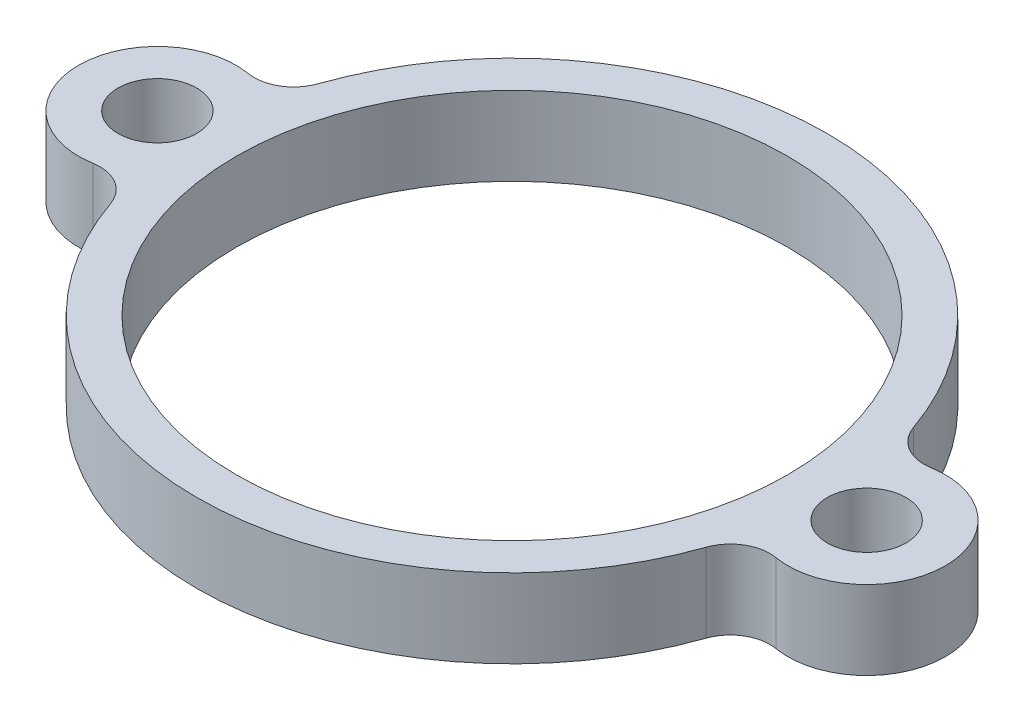
ISO-10303-21;
HEADER;
FILE_DESCRIPTION(('STEP AP214'),'2;1');
FILE_NAME('part.step','',(''),(''),'','','');
FILE_SCHEMA(('AUTOMOTIVE_DESIGN { 1 0 10303 214 1 1 1 1 }'));
ENDSEC;
DATA;
#1=APPLICATION_CONTEXT('core data for automotive mechanical design processes');
#2=APPLICATION_PROTOCOL_DEFINITION('international standard','automotive_design',2000,#1);
#3=PRODUCT_CONTEXT('',#1,'mechanical');
#4=PRODUCT('Part','Part','',(#3));
#5=PRODUCT_RELATED_PRODUCT_CATEGORY('part','',(#4));
#6=PRODUCT_DEFINITION_FORMATION('','',#4);
#7=PRODUCT_DEFINITION_CONTEXT('part definition',#1,'design');
#8=PRODUCT_DEFINITION('design','',#6,#7);
#9=PRODUCT_DEFINITION_SHAPE('','',#8);
#10=(LENGTH_UNIT() NAMED_UNIT(*) SI_UNIT(.MILLI.,.METRE.));
#11=(NAMED_UNIT(*) PLANE_ANGLE_UNIT() SI_UNIT($,.RADIAN.));
#12=(NAMED_UNIT(*) SI_UNIT($,.STERADIAN.) SOLID_ANGLE_UNIT());
#13=UNCERTAINTY_MEASURE_WITH_UNIT(LENGTH_MEASURE(1.E-05),#10,'distance_accuracy_value','');
#14=(GEOMETRIC_REPRESENTATION_CONTEXT(3) GLOBAL_UNCERTAINTY_ASSIGNED_CONTEXT((#13)) GLOBAL_UNIT_ASSIGNED_CONTEXT((#10,
#11,#12)) REPRESENTATION_CONTEXT('',''));
#15=CARTESIAN_POINT('',(0.,0.,0.));
#16=DIRECTION('',(0.,0.,1.));
#17=DIRECTION('',(1.,0.,0.));
#18=AXIS2_PLACEMENT_3D('',#15,#16,#17);
#19=CARTESIAN_POINT('',(21.25,10.,7.39509972887452));
#20=DIRECTION('',(0.,1.,0.));
#21=DIRECTION('',(0.,0.,1.));
#22=AXIS2_PLACEMENT_3D('',#19,#20,#21);
#23=PLANE('',#22);
#24=CARTESIAN_POINT('',(45.,10.,0.));
#25=DIRECTION('',(0.,1.,0.));
#26=DIRECTION('',(0.,0.,1.));
#27=AXIS2_PLACEMENT_3D('',#24,#25,#26);
#28=CIRCLE('',#27,5.);
#29=CARTESIAN_POINT('',(45.,10.,5.));
#30=VERTEX_POINT('',#29);
#31=EDGE_CURVE('E219',#30,#30,#28,.T.);
#32=ORIENTED_EDGE('',*,*,#31,.F.);
#33=EDGE_LOOP('',(#32));
#34=FACE_BOUND('',#33,.T.);
#35=CARTESIAN_POINT('',(42.5,10.,14.790199457749));
#36=DIRECTION('',(0.,-1.,0.));
#37=DIRECTION('',(0.,0.,1.));
#38=AXIS2_PLACEMENT_3D('',#35,#36,#37);
#39=CIRCLE('',#38,5.);
#40=CARTESIAN_POINT('',(37.7777777777778,10.,13.1468439624436));
#41=VERTEX_POINT('',#40);
#42=CARTESIAN_POINT('',(43.3333333333333,10.,9.86013297183269));
#43=VERTEX_POINT('',#42);
#44=EDGE_CURVE('E170',#41,#43,#39,.T.);
#45=ORIENTED_EDGE('',*,*,#44,.T.);
#46=CARTESIAN_POINT('',(45.,10.,0.));
#47=DIRECTION('',(0.,1.,0.));
#48=DIRECTION('',(0.,0.,1.));
#49=AXIS2_PLACEMENT_3D('',#46,#47,#48);
#50=CIRCLE('',#49,10.);
#51=CARTESIAN_POINT('',(43.3333333333333,10.,-9.86013297183269));
#52=VERTEX_POINT('',#51);
#53=EDGE_CURVE('E106',#43,#52,#50,.T.);
#54=ORIENTED_EDGE('',*,*,#53,.T.);
#55=CARTESIAN_POINT('',(42.5,10.,-14.790199457749));
#56=DIRECTION('',(0.,-1.,0.));
#57=DIRECTION('',(0.,0.,-1.));
#58=AXIS2_PLACEMENT_3D('',#55,#56,#57);
#59=CIRCLE('',#58,5.);
#60=CARTESIAN_POINT('',(37.7777777777778,10.,-13.1468439624436));
#61=VERTEX_POINT('',#60);
#62=EDGE_CURVE('E191',#52,#61,#59,.T.);
#63=ORIENTED_EDGE('',*,*,#62,.T.);
#64=CARTESIAN_POINT('',(0.,10.,0.));
#65=DIRECTION('',(0.,1.,0.));
#66=DIRECTION('',(0.,0.,1.));
#67=AXIS2_PLACEMENT_3D('',#64,#65,#66);
#68=CIRCLE('',#67,40.);
#69=CARTESIAN_POINT('',(-37.7777777777778,10.,-13.1468439624436));
#70=VERTEX_POINT('',#69);
#71=EDGE_CURVE('E205',#61,#70,#68,.T.);
#72=ORIENTED_EDGE('',*,*,#71,.T.);
#73=CARTESIAN_POINT('',(-42.5,10.,-14.790199457749));
#74=DIRECTION('',(0.,-1.,0.));
#75=DIRECTION('',(0.,0.,1.));
#76=AXIS2_PLACEMENT_3D('',#73,#74,#75);
#77=CIRCLE('',#76,5.);
#78=CARTESIAN_POINT('',(-43.3333333333333,10.,-9.86013297183269));
#79=VERTEX_POINT('',#78);
#80=EDGE_CURVE('E125',#70,#79,#77,.T.);
#81=ORIENTED_EDGE('',*,*,#80,.T.);
#82=CARTESIAN_POINT('',(-45.,10.,0.));
#83=DIRECTION('',(0.,1.,0.));
#84=DIRECTION('',(0.,0.,1.));
#85=AXIS2_PLACEMENT_3D('',#82,#83,#84);
#86=CIRCLE('',#85,10.);
#87=CARTESIAN_POINT('',(-43.3333333333333,10.,9.8601329718327));
#88=VERTEX_POINT('',#87);
#89=EDGE_CURVE('E119',#79,#88,#86,.T.);
#90=ORIENTED_EDGE('',*,*,#89,.T.);
#91=CARTESIAN_POINT('',(-42.5,10.,14.790199457749));
#92=DIRECTION('',(0.,-1.,0.));
#93=DIRECTION('',(0.,0.,-1.));
#94=AXIS2_PLACEMENT_3D('',#91,#92,#93);
#95=CIRCLE('',#94,5.);
#96=CARTESIAN_POINT('',(-37.7777777777778,10.,13.1468439624436));
#97=VERTEX_POINT('',#96);
#98=EDGE_CURVE('E123',#88,#97,#95,.T.);
#99=ORIENTED_EDGE('',*,*,#98,.T.);
#100=CARTESIAN_POINT('',(0.,10.,0.));
#101=DIRECTION('',(0.,1.,0.));
#102=DIRECTION('',(0.,0.,1.));
#103=AXIS2_PLACEMENT_3D('',#100,#101,#102);
#104=CIRCLE('',#103,40.);
#105=EDGE_CURVE('E63',#97,#41,#104,.T.);
#106=ORIENTED_EDGE('',*,*,#105,.T.);
#107=EDGE_LOOP('',(#45,#54,#63,#72,#81,#90,#99,#106));
#108=FACE_BOUND('',#107,.T.);
#109=CARTESIAN_POINT('',(0.,10.,0.));
#110=DIRECTION('',(0.,1.,0.));
#111=DIRECTION('',(0.,0.,1.));
#112=AXIS2_PLACEMENT_3D('',#109,#110,#111);
#113=CIRCLE('',#112,35.);
#114=CARTESIAN_POINT('',(0.,10.,35.));
#115=VERTEX_POINT('',#114);
#116=EDGE_CURVE('E152',#115,#115,#113,.T.);
#117=ORIENTED_EDGE('',*,*,#116,.F.);
#118=EDGE_LOOP('',(#117));
#119=FACE_BOUND('',#118,.T.);
#120=CARTESIAN_POINT('',(-45.,10.,0.));
#121=DIRECTION('',(0.,1.,0.));
#122=DIRECTION('',(0.,0.,1.));
#123=AXIS2_PLACEMENT_3D('',#120,#121,#122);
#124=CIRCLE('',#123,5.);
#125=CARTESIAN_POINT('',(-45.,10.,5.));
#126=VERTEX_POINT('',#125);
#127=EDGE_CURVE('E227',#126,#126,#124,.T.);
#128=ORIENTED_EDGE('',*,*,#127,.F.);
#129=EDGE_LOOP('',(#128));
#130=FACE_BOUND('',#129,.T.);
#131=ADVANCED_FACE('F45',(#34,#108,#119,#130),#23,.T.);
#132=CARTESIAN_POINT('',(21.25,0.,7.39509972887452));
#133=DIRECTION('',(0.,1.,0.));
#134=DIRECTION('',(0.,0.,1.));
#135=AXIS2_PLACEMENT_3D('',#132,#133,#134);
#136=PLANE('',#135);
#137=CARTESIAN_POINT('',(42.5,0.,14.790199457749));
#138=DIRECTION('',(0.,-1.,0.));
#139=DIRECTION('',(0.,0.,1.));
#140=AXIS2_PLACEMENT_3D('',#137,#138,#139);
#141=CIRCLE('',#140,5.);
#142=CARTESIAN_POINT('',(37.7777777777778,0.,13.1468439624436));
#143=VERTEX_POINT('',#142);
#144=CARTESIAN_POINT('',(43.3333333333333,0.,9.86013297183269));
#145=VERTEX_POINT('',#144);
#146=EDGE_CURVE('E147',#143,#145,#141,.T.);
#147=ORIENTED_EDGE('',*,*,#146,.F.);
#148=CARTESIAN_POINT('',(0.,0.,0.));
#149=DIRECTION('',(0.,1.,0.));
#150=DIRECTION('',(0.,0.,1.));
#151=AXIS2_PLACEMENT_3D('',#148,#149,#150);
#152=CIRCLE('',#151,40.);
#153=CARTESIAN_POINT('',(-37.7777777777778,0.,13.1468439624436));
#154=VERTEX_POINT('',#153);
#155=EDGE_CURVE('E98',#154,#143,#152,.T.);
#156=ORIENTED_EDGE('',*,*,#155,.F.);
#157=CARTESIAN_POINT('',(-42.5,0.,14.790199457749));
#158=DIRECTION('',(0.,-1.,0.));
#159=DIRECTION('',(0.,0.,-1.));
#160=AXIS2_PLACEMENT_3D('',#157,#158,#159);
#161=CIRCLE('',#160,5.);
#162=CARTESIAN_POINT('',(-43.3333333333333,0.,9.8601329718327));
#163=VERTEX_POINT('',#162);
#164=EDGE_CURVE('E92',#163,#154,#161,.T.);
#165=ORIENTED_EDGE('',*,*,#164,.F.);
#166=CARTESIAN_POINT('',(-45.,0.,0.));
#167=DIRECTION('',(0.,1.,0.));
#168=DIRECTION('',(0.,0.,1.));
#169=AXIS2_PLACEMENT_3D('',#166,#167,#168);
#170=CIRCLE('',#169,10.);
#171=CARTESIAN_POINT('',(-43.3333333333333,0.,-9.86013297183269));
#172=VERTEX_POINT('',#171);
#173=EDGE_CURVE('E134',#172,#163,#170,.T.);
#174=ORIENTED_EDGE('',*,*,#173,.F.);
#175=CARTESIAN_POINT('',(-42.5,0.,-14.790199457749));
#176=DIRECTION('',(0.,-1.,0.));
#177=DIRECTION('',(0.,0.,1.));
#178=AXIS2_PLACEMENT_3D('',#175,#176,#177);
#179=CIRCLE('',#178,5.);
#180=CARTESIAN_POINT('',(-37.7777777777778,0.,-13.1468439624436));
#181=VERTEX_POINT('',#180);
#182=EDGE_CURVE('E161',#181,#172,#179,.T.);
#183=ORIENTED_EDGE('',*,*,#182,.F.);
#184=CARTESIAN_POINT('',(0.,0.,0.));
#185=DIRECTION('',(0.,1.,0.));
#186=DIRECTION('',(0.,0.,1.));
#187=AXIS2_PLACEMENT_3D('',#184,#185,#186);
#188=CIRCLE('',#187,40.);
#189=CARTESIAN_POINT('',(37.7777777777778,0.,-13.1468439624436));
#190=VERTEX_POINT('',#189);
#191=EDGE_CURVE('E158',#190,#181,#188,.T.);
#192=ORIENTED_EDGE('',*,*,#191,.F.);
#193=CARTESIAN_POINT('',(42.5,0.,-14.790199457749));
#194=DIRECTION('',(0.,-1.,0.));
#195=DIRECTION('',(0.,0.,-1.));
#196=AXIS2_PLACEMENT_3D('',#193,#194,#195);
#197=CIRCLE('',#196,5.);
#198=CARTESIAN_POINT('',(43.3333333333333,0.,-9.86013297183269));
#199=VERTEX_POINT('',#198);
#200=EDGE_CURVE('E155',#199,#190,#197,.T.);
#201=ORIENTED_EDGE('',*,*,#200,.F.);
#202=CARTESIAN_POINT('',(45.,0.,0.));
#203=DIRECTION('',(0.,1.,0.));
#204=DIRECTION('',(0.,0.,1.));
#205=AXIS2_PLACEMENT_3D('',#202,#203,#204);
#206=CIRCLE('',#205,10.);
#207=EDGE_CURVE('E151',#145,#199,#206,.T.);
#208=ORIENTED_EDGE('',*,*,#207,.F.);
#209=EDGE_LOOP('',(#147,#156,#165,#174,#183,#192,#201,#208));
#210=FACE_BOUND('',#209,.T.);
#211=CARTESIAN_POINT('',(0.,0.,0.));
#212=DIRECTION('',(0.,1.,0.));
#213=DIRECTION('',(0.,0.,1.));
#214=AXIS2_PLACEMENT_3D('',#211,#212,#213);
#215=CIRCLE('',#214,35.);
#216=CARTESIAN_POINT('',(0.,0.,35.));
#217=VERTEX_POINT('',#216);
#218=EDGE_CURVE('E215',#217,#217,#215,.T.);
#219=ORIENTED_EDGE('',*,*,#218,.T.);
#220=EDGE_LOOP('',(#219));
#221=FACE_BOUND('',#220,.T.);
#222=CARTESIAN_POINT('',(45.,0.,0.));
#223=DIRECTION('',(0.,1.,0.));
#224=DIRECTION('',(0.,0.,1.));
#225=AXIS2_PLACEMENT_3D('',#222,#223,#224);
#226=CIRCLE('',#225,5.);
#227=CARTESIAN_POINT('',(45.,0.,5.));
#228=VERTEX_POINT('',#227);
#229=EDGE_CURVE('E223',#228,#228,#226,.T.);
#230=ORIENTED_EDGE('',*,*,#229,.T.);
#231=EDGE_LOOP('',(#230));
#232=FACE_BOUND('',#231,.T.);
#233=CARTESIAN_POINT('',(-45.,0.,0.));
#234=DIRECTION('',(0.,1.,0.));
#235=DIRECTION('',(0.,0.,1.));
#236=AXIS2_PLACEMENT_3D('',#233,#234,#235);
#237=CIRCLE('',#236,5.);
#238=CARTESIAN_POINT('',(-45.,0.,5.));
#239=VERTEX_POINT('',#238);
#240=EDGE_CURVE('E231',#239,#239,#237,.T.);
#241=ORIENTED_EDGE('',*,*,#240,.T.);
#242=EDGE_LOOP('',(#241));
#243=FACE_BOUND('',#242,.T.);
#244=ADVANCED_FACE('F195',(#210,#221,#232,#243),#136,.F.);
#245=CARTESIAN_POINT('',(42.5,10.,14.790199457749));
#246=DIRECTION('',(0.,-1.,0.));
#247=DIRECTION('',(0.,0.,-1.));
#248=AXIS2_PLACEMENT_3D('',#245,#246,#247);
#249=CYLINDRICAL_SURFACE('',#248,5.);
#250=ORIENTED_EDGE('',*,*,#146,.T.);
#251=DIRECTION('',(0.,-1.,0.));
#252=VECTOR('',#251,1.);
#253=CARTESIAN_POINT('',(43.3333333333333,10.,9.86013297183269));
#254=LINE('',#253,#252);
#255=EDGE_CURVE('E11',#43,#145,#254,.T.);
#256=ORIENTED_EDGE('',*,*,#255,.F.);
#257=ORIENTED_EDGE('',*,*,#44,.F.);
#258=DIRECTION('',(0.,-1.,0.));
#259=VECTOR('',#258,1.);
#260=CARTESIAN_POINT('',(37.7777777777778,10.,13.1468439624436));
#261=LINE('',#260,#259);
#262=EDGE_CURVE('E143',#41,#143,#261,.T.);
#263=ORIENTED_EDGE('',*,*,#262,.T.);
#264=EDGE_LOOP('',(#250,#256,#257,#263));
#265=FACE_BOUND('',#264,.T.);
#266=ADVANCED_FACE('F47',(#265),#249,.F.);
#267=CARTESIAN_POINT('',(45.,10.,0.));
#268=DIRECTION('',(0.,-1.,0.));
#269=DIRECTION('',(0.,0.,-1.));
#270=AXIS2_PLACEMENT_3D('',#267,#268,#269);
#271=CYLINDRICAL_SURFACE('',#270,10.);
#272=ORIENTED_EDGE('',*,*,#207,.T.);
#273=DIRECTION('',(0.,-1.,0.));
#274=VECTOR('',#273,1.);
#275=CARTESIAN_POINT('',(43.3333333333333,10.,-9.86013297183269));
#276=LINE('',#275,#274);
#277=EDGE_CURVE('E55',#52,#199,#276,.T.);
#278=ORIENTED_EDGE('',*,*,#277,.F.);
#279=ORIENTED_EDGE('',*,*,#53,.F.);
#280=ORIENTED_EDGE('',*,*,#255,.T.);
#281=EDGE_LOOP('',(#272,#278,#279,#280));
#282=FACE_BOUND('',#281,.T.);
#283=ADVANCED_FACE('F266',(#282),#271,.T.);
#284=CARTESIAN_POINT('',(42.5,10.,-14.790199457749));
#285=DIRECTION('',(0.,-1.,0.));
#286=DIRECTION('',(0.,0.,-1.));
#287=AXIS2_PLACEMENT_3D('',#284,#285,#286);
#288=CYLINDRICAL_SURFACE('',#287,5.);
#289=ORIENTED_EDGE('',*,*,#200,.T.);
#290=DIRECTION('',(0.,-1.,0.));
#291=VECTOR('',#290,1.);
#292=CARTESIAN_POINT('',(37.7777777777778,10.,-13.1468439624436));
#293=LINE('',#292,#291);
#294=EDGE_CURVE('E181',#61,#190,#293,.T.);
#295=ORIENTED_EDGE('',*,*,#294,.F.);
#296=ORIENTED_EDGE('',*,*,#62,.F.);
#297=ORIENTED_EDGE('',*,*,#277,.T.);
#298=EDGE_LOOP('',(#289,#295,#296,#297));
#299=FACE_BOUND('',#298,.T.);
#300=ADVANCED_FACE('F189',(#299),#288,.F.);
#301=CARTESIAN_POINT('',(0.,10.,0.));
#302=DIRECTION('',(0.,-1.,0.));
#303=DIRECTION('',(0.,0.,-1.));
#304=AXIS2_PLACEMENT_3D('',#301,#302,#303);
#305=CYLINDRICAL_SURFACE('',#304,40.);
#306=ORIENTED_EDGE('',*,*,#191,.T.);
#307=DIRECTION('',(0.,-1.,0.));
#308=VECTOR('',#307,1.);
#309=CARTESIAN_POINT('',(-37.7777777777778,10.,-13.1468439624436));
#310=LINE('',#309,#308);
#311=EDGE_CURVE('E177',#70,#181,#310,.T.);
#312=ORIENTED_EDGE('',*,*,#311,.F.);
#313=ORIENTED_EDGE('',*,*,#71,.F.);
#314=ORIENTED_EDGE('',*,*,#294,.T.);
#315=EDGE_LOOP('',(#306,#312,#313,#314));
#316=FACE_BOUND('',#315,.T.);
#317=ADVANCED_FACE('F200',(#316),#305,.T.);
#318=CARTESIAN_POINT('',(-42.5,10.,-14.790199457749));
#319=DIRECTION('',(0.,-1.,0.));
#320=DIRECTION('',(0.,0.,-1.));
#321=AXIS2_PLACEMENT_3D('',#318,#319,#320);
#322=CYLINDRICAL_SURFACE('',#321,5.);
#323=ORIENTED_EDGE('',*,*,#182,.T.);
#324=DIRECTION('',(0.,-1.,0.));
#325=VECTOR('',#324,1.);
#326=CARTESIAN_POINT('',(-43.3333333333333,10.,-9.86013297183269));
#327=LINE('',#326,#325);
#328=EDGE_CURVE('E136',#79,#172,#327,.T.);
#329=ORIENTED_EDGE('',*,*,#328,.F.);
#330=ORIENTED_EDGE('',*,*,#80,.F.);
#331=ORIENTED_EDGE('',*,*,#311,.T.);
#332=EDGE_LOOP('',(#323,#329,#330,#331));
#333=FACE_BOUND('',#332,.T.);
#334=ADVANCED_FACE('F203',(#333),#322,.F.);
#335=CARTESIAN_POINT('',(-45.,10.,0.));
#336=DIRECTION('',(0.,-1.,0.));
#337=DIRECTION('',(0.,0.,-1.));
#338=AXIS2_PLACEMENT_3D('',#335,#336,#337);
#339=CYLINDRICAL_SURFACE('',#338,10.);
#340=ORIENTED_EDGE('',*,*,#173,.T.);
#341=DIRECTION('',(0.,-1.,0.));
#342=VECTOR('',#341,1.);
#343=CARTESIAN_POINT('',(-43.3333333333333,10.,9.8601329718327));
#344=LINE('',#343,#342);
#345=EDGE_CURVE('E131',#88,#163,#344,.T.);
#346=ORIENTED_EDGE('',*,*,#345,.F.);
#347=ORIENTED_EDGE('',*,*,#89,.F.);
#348=ORIENTED_EDGE('',*,*,#328,.T.);
#349=EDGE_LOOP('',(#340,#346,#347,#348));
#350=FACE_BOUND('',#349,.T.);
#351=ADVANCED_FACE('F132',(#350),#339,.T.);
#352=CARTESIAN_POINT('',(-42.5,10.,14.790199457749));
#353=DIRECTION('',(0.,-1.,0.));
#354=DIRECTION('',(0.,0.,-1.));
#355=AXIS2_PLACEMENT_3D('',#352,#353,#354);
#356=CYLINDRICAL_SURFACE('',#355,5.);
#357=ORIENTED_EDGE('',*,*,#164,.T.);
#358=DIRECTION('',(0.,-1.,0.));
#359=VECTOR('',#358,1.);
#360=CARTESIAN_POINT('',(-37.7777777777778,10.,13.1468439624436));
#361=LINE('',#360,#359);
#362=EDGE_CURVE('E137',#97,#154,#361,.T.);
#363=ORIENTED_EDGE('',*,*,#362,.F.);
#364=ORIENTED_EDGE('',*,*,#98,.F.);
#365=ORIENTED_EDGE('',*,*,#345,.T.);
#366=EDGE_LOOP('',(#357,#363,#364,#365));
#367=FACE_BOUND('',#366,.T.);
#368=ADVANCED_FACE('F139',(#367),#356,.F.);
#369=CARTESIAN_POINT('',(0.,10.,0.));
#370=DIRECTION('',(0.,-1.,0.));
#371=DIRECTION('',(0.,0.,-1.));
#372=AXIS2_PLACEMENT_3D('',#369,#370,#371);
#373=CYLINDRICAL_SURFACE('',#372,40.);
#374=ORIENTED_EDGE('',*,*,#155,.T.);
#375=ORIENTED_EDGE('',*,*,#262,.F.);
#376=ORIENTED_EDGE('',*,*,#105,.F.);
#377=ORIENTED_EDGE('',*,*,#362,.T.);
#378=EDGE_LOOP('',(#374,#375,#376,#377));
#379=FACE_BOUND('',#378,.T.);
#380=ADVANCED_FACE('F254',(#379),#373,.T.);
#381=CARTESIAN_POINT('',(0.,10.,0.));
#382=DIRECTION('',(0.,-1.,0.));
#383=DIRECTION('',(0.,0.,-1.));
#384=AXIS2_PLACEMENT_3D('',#381,#382,#383);
#385=CYLINDRICAL_SURFACE('',#384,35.);
#386=ORIENTED_EDGE('',*,*,#116,.T.);
#387=EDGE_LOOP('',(#386));
#388=FACE_BOUND('',#387,.T.);
#389=ORIENTED_EDGE('',*,*,#218,.F.);
#390=EDGE_LOOP('',(#389));
#391=FACE_BOUND('',#390,.T.);
#392=ADVANCED_FACE('F251',(#388,#391),#385,.F.);
#393=CARTESIAN_POINT('',(45.,10.,0.));
#394=DIRECTION('',(0.,-1.,0.));
#395=DIRECTION('',(0.,0.,-1.));
#396=AXIS2_PLACEMENT_3D('',#393,#394,#395);
#397=CYLINDRICAL_SURFACE('',#396,5.);
#398=ORIENTED_EDGE('',*,*,#31,.T.);
#399=EDGE_LOOP('',(#398));
#400=FACE_BOUND('',#399,.T.);
#401=ORIENTED_EDGE('',*,*,#229,.F.);
#402=EDGE_LOOP('',(#401));
#403=FACE_BOUND('',#402,.T.);
#404=ADVANCED_FACE('F329',(#400,#403),#397,.F.);
#405=CARTESIAN_POINT('',(-45.,10.,0.));
#406=DIRECTION('',(0.,-1.,0.));
#407=DIRECTION('',(0.,0.,-1.));
#408=AXIS2_PLACEMENT_3D('',#405,#406,#407);
#409=CYLINDRICAL_SURFACE('',#408,5.);
#410=ORIENTED_EDGE('',*,*,#127,.T.);
#411=EDGE_LOOP('',(#410));
#412=FACE_BOUND('',#411,.T.);
#413=ORIENTED_EDGE('',*,*,#240,.F.);
#414=EDGE_LOOP('',(#413));
#415=FACE_BOUND('',#414,.T.);
#416=ADVANCED_FACE('F239',(#412,#415),#409,.F.);
#417=CLOSED_SHELL('',(#131,#244,#266,#283,#300,#317,#334,#351,#368,#380,#392,#404,#416));
#418=MANIFOLD_SOLID_BREP('B2',#417);
#419=ADVANCED_BREP_SHAPE_REPRESENTATION('',(#18,#418),#14);
#420=SHAPE_DEFINITION_REPRESENTATION(#9,#419);
ENDSEC;
END-ISO-10303-21;
